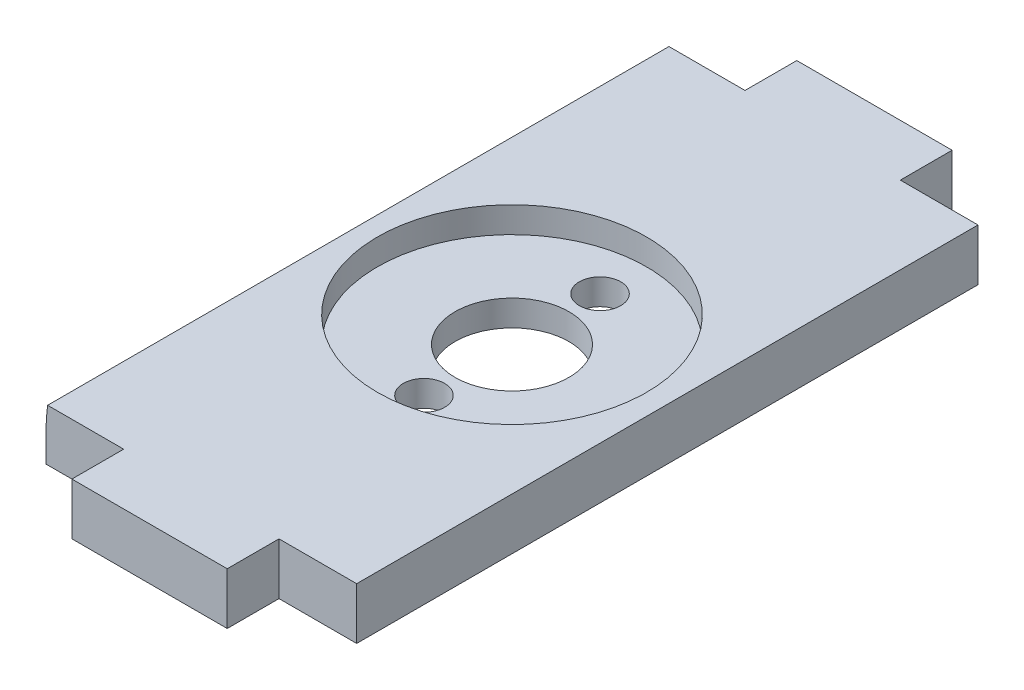
ISO-10303-21;
HEADER;
FILE_DESCRIPTION(('STEP AP214'),'2;1');
FILE_NAME('part.step','',(''),(''),'','','');
FILE_SCHEMA(('AUTOMOTIVE_DESIGN { 1 0 10303 214 1 1 1 1 }'));
ENDSEC;
DATA;
#1=APPLICATION_CONTEXT('core data for automotive mechanical design processes');
#2=APPLICATION_PROTOCOL_DEFINITION('international standard','automotive_design',2000,#1);
#3=PRODUCT_CONTEXT('',#1,'mechanical');
#4=PRODUCT('Part','Part','',(#3));
#5=PRODUCT_RELATED_PRODUCT_CATEGORY('part','',(#4));
#6=PRODUCT_DEFINITION_FORMATION('','',#4);
#7=PRODUCT_DEFINITION_CONTEXT('part definition',#1,'design');
#8=PRODUCT_DEFINITION('design','',#6,#7);
#9=PRODUCT_DEFINITION_SHAPE('','',#8);
#10=(LENGTH_UNIT() NAMED_UNIT(*) SI_UNIT(.MILLI.,.METRE.));
#11=(NAMED_UNIT(*) PLANE_ANGLE_UNIT() SI_UNIT($,.RADIAN.));
#12=(NAMED_UNIT(*) SI_UNIT($,.STERADIAN.) SOLID_ANGLE_UNIT());
#13=UNCERTAINTY_MEASURE_WITH_UNIT(LENGTH_MEASURE(1.E-05),#10,'distance_accuracy_value','');
#14=(GEOMETRIC_REPRESENTATION_CONTEXT(3) GLOBAL_UNCERTAINTY_ASSIGNED_CONTEXT((#13)) GLOBAL_UNIT_ASSIGNED_CONTEXT((#10,
#11,#12)) REPRESENTATION_CONTEXT('',''));
#15=CARTESIAN_POINT('',(0.,0.,0.));
#16=DIRECTION('',(0.,0.,1.));
#17=DIRECTION('',(1.,0.,0.));
#18=AXIS2_PLACEMENT_3D('',#15,#16,#17);
#19=CARTESIAN_POINT('',(0.,5.,0.));
#20=DIRECTION('',(0.,-1.,0.));
#21=DIRECTION('',(0.,0.,-1.));
#22=AXIS2_PLACEMENT_3D('',#19,#20,#21);
#23=CYLINDRICAL_SURFACE('',#22,5.5);
#24=CARTESIAN_POINT('',(0.,0.,0.));
#25=DIRECTION('',(0.,1.,0.));
#26=DIRECTION('',(0.,0.,1.));
#27=AXIS2_PLACEMENT_3D('',#24,#25,#26);
#28=CIRCLE('',#27,5.5);
#29=CARTESIAN_POINT('',(0.,0.,5.5));
#30=VERTEX_POINT('',#29);
#31=EDGE_CURVE('E178',#30,#30,#28,.T.);
#32=ORIENTED_EDGE('',*,*,#31,.F.);
#33=EDGE_LOOP('',(#32));
#34=FACE_BOUND('',#33,.T.);
#35=CARTESIAN_POINT('',(0.,2.5,0.));
#36=DIRECTION('',(0.,1.,0.));
#37=DIRECTION('',(0.,0.,1.));
#38=AXIS2_PLACEMENT_3D('',#35,#36,#37);
#39=CIRCLE('',#38,5.5);
#40=CARTESIAN_POINT('',(0.,2.5,5.5));
#41=VERTEX_POINT('',#40);
#42=EDGE_CURVE('E311',#41,#41,#39,.T.);
#43=ORIENTED_EDGE('',*,*,#42,.T.);
#44=EDGE_LOOP('',(#43));
#45=FACE_BOUND('',#44,.T.);
#46=ADVANCED_FACE('F39',(#34,#45),#23,.F.);
#47=CARTESIAN_POINT('',(0.,5.,-8.5));
#48=DIRECTION('',(0.,-1.,0.));
#49=DIRECTION('',(0.,0.,-1.));
#50=AXIS2_PLACEMENT_3D('',#47,#48,#49);
#51=CYLINDRICAL_SURFACE('',#50,2.);
#52=CARTESIAN_POINT('',(0.,0.,-8.5));
#53=DIRECTION('',(0.,1.,0.));
#54=DIRECTION('',(0.,0.,1.));
#55=AXIS2_PLACEMENT_3D('',#52,#53,#54);
#56=CIRCLE('',#55,2.);
#57=CARTESIAN_POINT('',(0.,0.,-6.5));
#58=VERTEX_POINT('',#57);
#59=EDGE_CURVE('E303',#58,#58,#56,.T.);
#60=ORIENTED_EDGE('',*,*,#59,.F.);
#61=EDGE_LOOP('',(#60));
#62=FACE_BOUND('',#61,.T.);
#63=CARTESIAN_POINT('',(0.,2.5,-8.5));
#64=DIRECTION('',(0.,1.,0.));
#65=DIRECTION('',(0.,0.,1.));
#66=AXIS2_PLACEMENT_3D('',#63,#64,#65);
#67=CIRCLE('',#66,2.);
#68=CARTESIAN_POINT('',(0.,2.5,-6.5));
#69=VERTEX_POINT('',#68);
#70=EDGE_CURVE('E315',#69,#69,#67,.T.);
#71=ORIENTED_EDGE('',*,*,#70,.T.);
#72=EDGE_LOOP('',(#71));
#73=FACE_BOUND('',#72,.T.);
#74=ADVANCED_FACE('F356',(#62,#73),#51,.F.);
#75=CARTESIAN_POINT('',(0.,5.,8.5));
#76=DIRECTION('',(0.,-1.,0.));
#77=DIRECTION('',(0.,0.,-1.));
#78=AXIS2_PLACEMENT_3D('',#75,#76,#77);
#79=CYLINDRICAL_SURFACE('',#78,2.);
#80=CARTESIAN_POINT('',(0.,0.,8.5));
#81=DIRECTION('',(0.,1.,0.));
#82=DIRECTION('',(0.,0.,1.));
#83=AXIS2_PLACEMENT_3D('',#80,#81,#82);
#84=CIRCLE('',#83,2.);
#85=CARTESIAN_POINT('',(0.,0.,10.5));
#86=VERTEX_POINT('',#85);
#87=EDGE_CURVE('E307',#86,#86,#84,.T.);
#88=ORIENTED_EDGE('',*,*,#87,.F.);
#89=EDGE_LOOP('',(#88));
#90=FACE_BOUND('',#89,.T.);
#91=CARTESIAN_POINT('',(0.,2.5,8.5));
#92=DIRECTION('',(0.,1.,0.));
#93=DIRECTION('',(0.,0.,1.));
#94=AXIS2_PLACEMENT_3D('',#91,#92,#93);
#95=CIRCLE('',#94,2.);
#96=CARTESIAN_POINT('',(0.,2.5,10.5));
#97=VERTEX_POINT('',#96);
#98=EDGE_CURVE('E43',#97,#97,#95,.T.);
#99=ORIENTED_EDGE('',*,*,#98,.T.);
#100=EDGE_LOOP('',(#99));
#101=FACE_BOUND('',#100,.T.);
#102=ADVANCED_FACE('F362',(#90,#101),#79,.F.);
#103=CARTESIAN_POINT('',(0.,5.,0.));
#104=DIRECTION('',(0.,1.,0.));
#105=DIRECTION('',(0.,0.,1.));
#106=AXIS2_PLACEMENT_3D('',#103,#104,#105);
#107=PLANE('',#106);
#108=DIRECTION('',(0.,0.,1.));
#109=VECTOR('',#108,1.);
#110=CARTESIAN_POINT('',(-14.8431348329844,5.,-32.5049165017267));
#111=LINE('',#110,#109);
#112=CARTESIAN_POINT('',(-14.8431348329844,5.,-30.));
#113=VERTEX_POINT('',#112);
#114=CARTESIAN_POINT('',(-14.8431348329844,5.,30.));
#115=VERTEX_POINT('',#114);
#116=EDGE_CURVE('E329',#113,#115,#111,.T.);
#117=ORIENTED_EDGE('',*,*,#116,.T.);
#118=DIRECTION('',(1.,0.,0.));
#119=VECTOR('',#118,1.);
#120=CARTESIAN_POINT('',(-15.,5.,30.));
#121=LINE('',#120,#119);
#122=CARTESIAN_POINT('',(-7.5,5.,30.));
#123=VERTEX_POINT('',#122);
#124=EDGE_CURVE('E268',#115,#123,#121,.T.);
#125=ORIENTED_EDGE('',*,*,#124,.T.);
#126=DIRECTION('',(0.,0.,1.));
#127=VECTOR('',#126,1.);
#128=CARTESIAN_POINT('',(-7.5,5.,30.));
#129=LINE('',#128,#127);
#130=CARTESIAN_POINT('',(-7.5,5.,35.));
#131=VERTEX_POINT('',#130);
#132=EDGE_CURVE('E273',#123,#131,#129,.T.);
#133=ORIENTED_EDGE('',*,*,#132,.T.);
#134=DIRECTION('',(1.,0.,0.));
#135=VECTOR('',#134,1.);
#136=CARTESIAN_POINT('',(-7.5,5.,35.));
#137=LINE('',#136,#135);
#138=CARTESIAN_POINT('',(7.5,5.,35.));
#139=VERTEX_POINT('',#138);
#140=EDGE_CURVE('E148',#131,#139,#137,.T.);
#141=ORIENTED_EDGE('',*,*,#140,.T.);
#142=DIRECTION('',(0.,0.,-1.));
#143=VECTOR('',#142,1.);
#144=CARTESIAN_POINT('',(7.5,5.,30.));
#145=LINE('',#144,#143);
#146=CARTESIAN_POINT('',(7.5,5.,30.));
#147=VERTEX_POINT('',#146);
#148=EDGE_CURVE('E139',#139,#147,#145,.T.);
#149=ORIENTED_EDGE('',*,*,#148,.T.);
#150=DIRECTION('',(1.,0.,0.));
#151=VECTOR('',#150,1.);
#152=CARTESIAN_POINT('',(7.5,5.,30.));
#153=LINE('',#152,#151);
#154=CARTESIAN_POINT('',(15.,5.,30.));
#155=VERTEX_POINT('',#154);
#156=EDGE_CURVE('E145',#147,#155,#153,.T.);
#157=ORIENTED_EDGE('',*,*,#156,.T.);
#158=DIRECTION('',(0.,0.,-1.));
#159=VECTOR('',#158,1.);
#160=CARTESIAN_POINT('',(15.,5.,30.));
#161=LINE('',#160,#159);
#162=CARTESIAN_POINT('',(15.,5.,-30.));
#163=VERTEX_POINT('',#162);
#164=EDGE_CURVE('E65',#155,#163,#161,.T.);
#165=ORIENTED_EDGE('',*,*,#164,.T.);
#166=DIRECTION('',(-1.,0.,0.));
#167=VECTOR('',#166,1.);
#168=CARTESIAN_POINT('',(7.5,5.,-30.));
#169=LINE('',#168,#167);
#170=CARTESIAN_POINT('',(7.5,5.,-30.));
#171=VERTEX_POINT('',#170);
#172=EDGE_CURVE('E211',#163,#171,#169,.T.);
#173=ORIENTED_EDGE('',*,*,#172,.T.);
#174=DIRECTION('',(0.,0.,-1.));
#175=VECTOR('',#174,1.);
#176=CARTESIAN_POINT('',(7.5,5.,-30.));
#177=LINE('',#176,#175);
#178=CARTESIAN_POINT('',(7.5,5.,-35.));
#179=VERTEX_POINT('',#178);
#180=EDGE_CURVE('E118',#171,#179,#177,.T.);
#181=ORIENTED_EDGE('',*,*,#180,.T.);
#182=DIRECTION('',(-1.,0.,0.));
#183=VECTOR('',#182,1.);
#184=CARTESIAN_POINT('',(-7.5,5.,-35.));
#185=LINE('',#184,#183);
#186=CARTESIAN_POINT('',(-7.5,5.,-35.));
#187=VERTEX_POINT('',#186);
#188=EDGE_CURVE('E247',#179,#187,#185,.T.);
#189=ORIENTED_EDGE('',*,*,#188,.T.);
#190=DIRECTION('',(0.,0.,1.));
#191=VECTOR('',#190,1.);
#192=CARTESIAN_POINT('',(-7.5,5.,-30.));
#193=LINE('',#192,#191);
#194=CARTESIAN_POINT('',(-7.5,5.,-30.));
#195=VERTEX_POINT('',#194);
#196=EDGE_CURVE('E269',#187,#195,#193,.T.);
#197=ORIENTED_EDGE('',*,*,#196,.T.);
#198=DIRECTION('',(-1.,0.,0.));
#199=VECTOR('',#198,1.);
#200=CARTESIAN_POINT('',(-15.,5.,-30.));
#201=LINE('',#200,#199);
#202=EDGE_CURVE('E265',#195,#113,#201,.T.);
#203=ORIENTED_EDGE('',*,*,#202,.T.);
#204=EDGE_LOOP('',(#117,#125,#133,#141,#149,#157,#165,#173,#181,#189,#197,#203));
#205=FACE_BOUND('',#204,.T.);
#206=CARTESIAN_POINT('',(0.,5.,0.));
#207=DIRECTION('',(0.,1.,0.));
#208=DIRECTION('',(0.,0.,1.));
#209=AXIS2_PLACEMENT_3D('',#206,#207,#208);
#210=CIRCLE('',#209,13.);
#211=CARTESIAN_POINT('',(0.,5.,13.));
#212=VERTEX_POINT('',#211);
#213=EDGE_CURVE('E319',#212,#212,#210,.T.);
#214=ORIENTED_EDGE('',*,*,#213,.F.);
#215=EDGE_LOOP('',(#214));
#216=FACE_BOUND('',#215,.T.);
#217=ADVANCED_FACE('F142',(#205,#216),#107,.T.);
#218=CARTESIAN_POINT('',(0.,0.,0.));
#219=DIRECTION('',(0.,1.,0.));
#220=DIRECTION('',(0.,0.,1.));
#221=AXIS2_PLACEMENT_3D('',#218,#219,#220);
#222=PLANE('',#221);
#223=DIRECTION('',(-1.,0.,0.));
#224=VECTOR('',#223,1.);
#225=CARTESIAN_POINT('',(7.5,0.,-30.));
#226=LINE('',#225,#224);
#227=CARTESIAN_POINT('',(15.,0.,-30.));
#228=VERTEX_POINT('',#227);
#229=CARTESIAN_POINT('',(7.5,0.,-30.));
#230=VERTEX_POINT('',#229);
#231=EDGE_CURVE('E173',#228,#230,#226,.T.);
#232=ORIENTED_EDGE('',*,*,#231,.F.);
#233=DIRECTION('',(0.,0.,-1.));
#234=VECTOR('',#233,1.);
#235=CARTESIAN_POINT('',(15.,0.,30.));
#236=LINE('',#235,#234);
#237=CARTESIAN_POINT('',(15.,0.,30.));
#238=VERTEX_POINT('',#237);
#239=EDGE_CURVE('E110',#238,#228,#236,.T.);
#240=ORIENTED_EDGE('',*,*,#239,.F.);
#241=DIRECTION('',(1.,0.,0.));
#242=VECTOR('',#241,1.);
#243=CARTESIAN_POINT('',(7.5,0.,30.));
#244=LINE('',#243,#242);
#245=CARTESIAN_POINT('',(7.5,0.,30.));
#246=VERTEX_POINT('',#245);
#247=EDGE_CURVE('E206',#246,#238,#244,.T.);
#248=ORIENTED_EDGE('',*,*,#247,.F.);
#249=DIRECTION('',(0.,0.,-1.));
#250=VECTOR('',#249,1.);
#251=CARTESIAN_POINT('',(7.5,0.,30.));
#252=LINE('',#251,#250);
#253=CARTESIAN_POINT('',(7.5,0.,35.));
#254=VERTEX_POINT('',#253);
#255=EDGE_CURVE('E158',#254,#246,#252,.T.);
#256=ORIENTED_EDGE('',*,*,#255,.F.);
#257=DIRECTION('',(1.,0.,0.));
#258=VECTOR('',#257,1.);
#259=CARTESIAN_POINT('',(-7.5,0.,35.));
#260=LINE('',#259,#258);
#261=CARTESIAN_POINT('',(-7.5,0.,35.));
#262=VERTEX_POINT('',#261);
#263=EDGE_CURVE('E201',#262,#254,#260,.T.);
#264=ORIENTED_EDGE('',*,*,#263,.F.);
#265=DIRECTION('',(0.,0.,1.));
#266=VECTOR('',#265,1.);
#267=CARTESIAN_POINT('',(-7.5,0.,30.));
#268=LINE('',#267,#266);
#269=CARTESIAN_POINT('',(-7.5,0.,30.));
#270=VERTEX_POINT('',#269);
#271=EDGE_CURVE('E198',#270,#262,#268,.T.);
#272=ORIENTED_EDGE('',*,*,#271,.F.);
#273=DIRECTION('',(1.,0.,0.));
#274=VECTOR('',#273,1.);
#275=CARTESIAN_POINT('',(-15.,0.,30.));
#276=LINE('',#275,#274);
#277=CARTESIAN_POINT('',(-15.,0.,30.));
#278=VERTEX_POINT('',#277);
#279=EDGE_CURVE('E195',#278,#270,#276,.T.);
#280=ORIENTED_EDGE('',*,*,#279,.F.);
#281=DIRECTION('',(0.,0.,1.));
#282=VECTOR('',#281,1.);
#283=CARTESIAN_POINT('',(-15.,0.,30.));
#284=LINE('',#283,#282);
#285=CARTESIAN_POINT('',(-15.,0.,-30.));
#286=VERTEX_POINT('',#285);
#287=EDGE_CURVE('E191',#286,#278,#284,.T.);
#288=ORIENTED_EDGE('',*,*,#287,.F.);
#289=DIRECTION('',(-1.,0.,0.));
#290=VECTOR('',#289,1.);
#291=CARTESIAN_POINT('',(-15.,0.,-30.));
#292=LINE('',#291,#290);
#293=CARTESIAN_POINT('',(-7.5,0.,-30.));
#294=VERTEX_POINT('',#293);
#295=EDGE_CURVE('E187',#294,#286,#292,.T.);
#296=ORIENTED_EDGE('',*,*,#295,.F.);
#297=DIRECTION('',(0.,0.,1.));
#298=VECTOR('',#297,1.);
#299=CARTESIAN_POINT('',(-7.5,0.,-30.));
#300=LINE('',#299,#298);
#301=CARTESIAN_POINT('',(-7.5,0.,-35.));
#302=VERTEX_POINT('',#301);
#303=EDGE_CURVE('E184',#302,#294,#300,.T.);
#304=ORIENTED_EDGE('',*,*,#303,.F.);
#305=DIRECTION('',(-1.,0.,0.));
#306=VECTOR('',#305,1.);
#307=CARTESIAN_POINT('',(-7.5,0.,-35.));
#308=LINE('',#307,#306);
#309=CARTESIAN_POINT('',(7.5,0.,-35.));
#310=VERTEX_POINT('',#309);
#311=EDGE_CURVE('E181',#310,#302,#308,.T.);
#312=ORIENTED_EDGE('',*,*,#311,.F.);
#313=DIRECTION('',(0.,0.,-1.));
#314=VECTOR('',#313,1.);
#315=CARTESIAN_POINT('',(7.5,0.,-30.));
#316=LINE('',#315,#314);
#317=EDGE_CURVE('E177',#230,#310,#316,.T.);
#318=ORIENTED_EDGE('',*,*,#317,.F.);
#319=EDGE_LOOP('',(#232,#240,#248,#256,#264,#272,#280,#288,#296,#304,#312,#318));
#320=FACE_BOUND('',#319,.T.);
#321=ORIENTED_EDGE('',*,*,#31,.T.);
#322=EDGE_LOOP('',(#321));
#323=FACE_BOUND('',#322,.T.);
#324=ORIENTED_EDGE('',*,*,#59,.T.);
#325=EDGE_LOOP('',(#324));
#326=FACE_BOUND('',#325,.T.);
#327=ORIENTED_EDGE('',*,*,#87,.T.);
#328=EDGE_LOOP('',(#327));
#329=FACE_BOUND('',#328,.T.);
#330=ADVANCED_FACE('F251',(#320,#323,#326,#329),#222,.F.);
#331=CARTESIAN_POINT('',(7.5,5.,-30.));
#332=DIRECTION('',(0.,0.,1.));
#333=DIRECTION('',(1.,0.,0.));
#334=AXIS2_PLACEMENT_3D('',#331,#332,#333);
#335=PLANE('',#334);
#336=ORIENTED_EDGE('',*,*,#231,.T.);
#337=DIRECTION('',(0.,-1.,0.));
#338=VECTOR('',#337,1.);
#339=CARTESIAN_POINT('',(7.5,5.,-30.));
#340=LINE('',#339,#338);
#341=EDGE_CURVE('E11',#171,#230,#340,.T.);
#342=ORIENTED_EDGE('',*,*,#341,.F.);
#343=ORIENTED_EDGE('',*,*,#172,.F.);
#344=DIRECTION('',(0.,-1.,0.));
#345=VECTOR('',#344,1.);
#346=CARTESIAN_POINT('',(15.,5.,-30.));
#347=LINE('',#346,#345);
#348=EDGE_CURVE('E169',#163,#228,#347,.T.);
#349=ORIENTED_EDGE('',*,*,#348,.T.);
#350=EDGE_LOOP('',(#336,#342,#343,#349));
#351=FACE_BOUND('',#350,.T.);
#352=ADVANCED_FACE('F41',(#351),#335,.F.);
#353=CARTESIAN_POINT('',(7.5,5.,-30.));
#354=DIRECTION('',(-1.,0.,0.));
#355=DIRECTION('',(0.,0.,1.));
#356=AXIS2_PLACEMENT_3D('',#353,#354,#355);
#357=PLANE('',#356);
#358=ORIENTED_EDGE('',*,*,#317,.T.);
#359=DIRECTION('',(0.,-1.,0.));
#360=VECTOR('',#359,1.);
#361=CARTESIAN_POINT('',(7.5,5.,-35.));
#362=LINE('',#361,#360);
#363=EDGE_CURVE('E49',#179,#310,#362,.T.);
#364=ORIENTED_EDGE('',*,*,#363,.F.);
#365=ORIENTED_EDGE('',*,*,#180,.F.);
#366=ORIENTED_EDGE('',*,*,#341,.T.);
#367=EDGE_LOOP('',(#358,#364,#365,#366));
#368=FACE_BOUND('',#367,.T.);
#369=ADVANCED_FACE('F460',(#368),#357,.F.);
#370=CARTESIAN_POINT('',(-7.5,5.,-35.));
#371=DIRECTION('',(0.,0.,1.));
#372=DIRECTION('',(1.,0.,0.));
#373=AXIS2_PLACEMENT_3D('',#370,#371,#372);
#374=PLANE('',#373);
#375=ORIENTED_EDGE('',*,*,#311,.T.);
#376=DIRECTION('',(0.,-1.,0.));
#377=VECTOR('',#376,1.);
#378=CARTESIAN_POINT('',(-7.5,5.,-35.));
#379=LINE('',#378,#377);
#380=EDGE_CURVE('E236',#187,#302,#379,.T.);
#381=ORIENTED_EDGE('',*,*,#380,.F.);
#382=ORIENTED_EDGE('',*,*,#188,.F.);
#383=ORIENTED_EDGE('',*,*,#363,.T.);
#384=EDGE_LOOP('',(#375,#381,#382,#383));
#385=FACE_BOUND('',#384,.T.);
#386=ADVANCED_FACE('F245',(#385),#374,.F.);
#387=CARTESIAN_POINT('',(-7.5,5.,-30.));
#388=DIRECTION('',(1.,0.,0.));
#389=DIRECTION('',(0.,0.,-1.));
#390=AXIS2_PLACEMENT_3D('',#387,#388,#389);
#391=PLANE('',#390);
#392=ORIENTED_EDGE('',*,*,#303,.T.);
#393=DIRECTION('',(0.,-1.,0.));
#394=VECTOR('',#393,1.);
#395=CARTESIAN_POINT('',(-7.5,5.,-30.));
#396=LINE('',#395,#394);
#397=EDGE_CURVE('E232',#195,#294,#396,.T.);
#398=ORIENTED_EDGE('',*,*,#397,.F.);
#399=ORIENTED_EDGE('',*,*,#196,.F.);
#400=ORIENTED_EDGE('',*,*,#380,.T.);
#401=EDGE_LOOP('',(#392,#398,#399,#400));
#402=FACE_BOUND('',#401,.T.);
#403=ADVANCED_FACE('F257',(#402),#391,.F.);
#404=CARTESIAN_POINT('',(-15.,5.,-30.));
#405=DIRECTION('',(0.,0.,1.));
#406=DIRECTION('',(1.,0.,0.));
#407=AXIS2_PLACEMENT_3D('',#404,#405,#406);
#408=PLANE('',#407);
#409=DIRECTION('',(0.,-1.,0.));
#410=VECTOR('',#409,1.);
#411=CARTESIAN_POINT('',(-15.,5.,-30.));
#412=LINE('',#411,#410);
#413=CARTESIAN_POINT('',(-15.,2.5,-30.));
#414=VERTEX_POINT('',#413);
#415=EDGE_CURVE('E229',#414,#286,#412,.T.);
#416=ORIENTED_EDGE('',*,*,#415,.F.);
#417=CARTESIAN_POINT('',(5.,2.5,-30.));
#418=DIRECTION('',(0.,0.,1.));
#419=DIRECTION('',(1.,0.,0.));
#420=AXIS2_PLACEMENT_3D('',#417,#418,#419);
#421=CIRCLE('',#420,20.);
#422=EDGE_CURVE('E266',#113,#414,#421,.T.);
#423=ORIENTED_EDGE('',*,*,#422,.F.);
#424=ORIENTED_EDGE('',*,*,#202,.F.);
#425=ORIENTED_EDGE('',*,*,#397,.T.);
#426=ORIENTED_EDGE('',*,*,#295,.T.);
#427=EDGE_LOOP('',(#416,#423,#424,#425,#426));
#428=FACE_BOUND('',#427,.T.);
#429=ADVANCED_FACE('F262',(#428),#408,.F.);
#430=CARTESIAN_POINT('',(-15.,5.,30.));
#431=DIRECTION('',(1.,0.,0.));
#432=DIRECTION('',(0.,0.,-1.));
#433=AXIS2_PLACEMENT_3D('',#430,#431,#432);
#434=PLANE('',#433);
#435=DIRECTION('',(0.,-1.,0.));
#436=VECTOR('',#435,1.);
#437=CARTESIAN_POINT('',(-15.,5.,30.));
#438=LINE('',#437,#436);
#439=CARTESIAN_POINT('',(-15.,2.5,30.));
#440=VERTEX_POINT('',#439);
#441=EDGE_CURVE('E226',#440,#278,#438,.T.);
#442=ORIENTED_EDGE('',*,*,#441,.F.);
#443=DIRECTION('',(0.,0.,1.));
#444=VECTOR('',#443,1.);
#445=CARTESIAN_POINT('',(-15.,2.5,-32.5049165017267));
#446=LINE('',#445,#444);
#447=EDGE_CURVE('E56',#414,#440,#446,.T.);
#448=ORIENTED_EDGE('',*,*,#447,.F.);
#449=ORIENTED_EDGE('',*,*,#415,.T.);
#450=ORIENTED_EDGE('',*,*,#287,.T.);
#451=EDGE_LOOP('',(#442,#448,#449,#450));
#452=FACE_BOUND('',#451,.T.);
#453=ADVANCED_FACE('F342',(#452),#434,.F.);
#454=CARTESIAN_POINT('',(-15.,5.,30.));
#455=DIRECTION('',(0.,0.,-1.));
#456=DIRECTION('',(-1.,0.,0.));
#457=AXIS2_PLACEMENT_3D('',#454,#455,#456);
#458=PLANE('',#457);
#459=ORIENTED_EDGE('',*,*,#124,.F.);
#460=CARTESIAN_POINT('',(5.,2.5,30.));
#461=DIRECTION('',(0.,0.,-1.));
#462=DIRECTION('',(1.,0.,0.));
#463=AXIS2_PLACEMENT_3D('',#460,#461,#462);
#464=CIRCLE('',#463,20.);
#465=EDGE_CURVE('E330',#440,#115,#464,.T.);
#466=ORIENTED_EDGE('',*,*,#465,.F.);
#467=ORIENTED_EDGE('',*,*,#441,.T.);
#468=ORIENTED_EDGE('',*,*,#279,.T.);
#469=DIRECTION('',(0.,-1.,0.));
#470=VECTOR('',#469,1.);
#471=CARTESIAN_POINT('',(-7.5,5.,30.));
#472=LINE('',#471,#470);
#473=EDGE_CURVE('E222',#123,#270,#472,.T.);
#474=ORIENTED_EDGE('',*,*,#473,.F.);
#475=EDGE_LOOP('',(#459,#466,#467,#468,#474));
#476=FACE_BOUND('',#475,.T.);
#477=ADVANCED_FACE('F345',(#476),#458,.F.);
#478=CARTESIAN_POINT('',(-7.5,5.,30.));
#479=DIRECTION('',(1.,0.,0.));
#480=DIRECTION('',(0.,0.,-1.));
#481=AXIS2_PLACEMENT_3D('',#478,#479,#480);
#482=PLANE('',#481);
#483=ORIENTED_EDGE('',*,*,#271,.T.);
#484=DIRECTION('',(0.,-1.,0.));
#485=VECTOR('',#484,1.);
#486=CARTESIAN_POINT('',(-7.5,5.,35.));
#487=LINE('',#486,#485);
#488=EDGE_CURVE('E218',#131,#262,#487,.T.);
#489=ORIENTED_EDGE('',*,*,#488,.F.);
#490=ORIENTED_EDGE('',*,*,#132,.F.);
#491=ORIENTED_EDGE('',*,*,#473,.T.);
#492=EDGE_LOOP('',(#483,#489,#490,#491));
#493=FACE_BOUND('',#492,.T.);
#494=ADVANCED_FACE('F285',(#493),#482,.F.);
#495=CARTESIAN_POINT('',(-7.5,5.,35.));
#496=DIRECTION('',(0.,0.,-1.));
#497=DIRECTION('',(-1.,0.,0.));
#498=AXIS2_PLACEMENT_3D('',#495,#496,#497);
#499=PLANE('',#498);
#500=ORIENTED_EDGE('',*,*,#263,.T.);
#501=DIRECTION('',(0.,-1.,0.));
#502=VECTOR('',#501,1.);
#503=CARTESIAN_POINT('',(7.5,5.,35.));
#504=LINE('',#503,#502);
#505=EDGE_CURVE('E162',#139,#254,#504,.T.);
#506=ORIENTED_EDGE('',*,*,#505,.F.);
#507=ORIENTED_EDGE('',*,*,#140,.F.);
#508=ORIENTED_EDGE('',*,*,#488,.T.);
#509=EDGE_LOOP('',(#500,#506,#507,#508));
#510=FACE_BOUND('',#509,.T.);
#511=ADVANCED_FACE('F289',(#510),#499,.F.);
#512=CARTESIAN_POINT('',(7.5,5.,30.));
#513=DIRECTION('',(-1.,0.,0.));
#514=DIRECTION('',(0.,0.,1.));
#515=AXIS2_PLACEMENT_3D('',#512,#513,#514);
#516=PLANE('',#515);
#517=ORIENTED_EDGE('',*,*,#255,.T.);
#518=DIRECTION('',(0.,-1.,0.));
#519=VECTOR('',#518,1.);
#520=CARTESIAN_POINT('',(7.5,5.,30.));
#521=LINE('',#520,#519);
#522=EDGE_CURVE('E155',#147,#246,#521,.T.);
#523=ORIENTED_EDGE('',*,*,#522,.F.);
#524=ORIENTED_EDGE('',*,*,#148,.F.);
#525=ORIENTED_EDGE('',*,*,#505,.T.);
#526=EDGE_LOOP('',(#517,#523,#524,#525));
#527=FACE_BOUND('',#526,.T.);
#528=ADVANCED_FACE('F156',(#527),#516,.F.);
#529=CARTESIAN_POINT('',(7.5,5.,30.));
#530=DIRECTION('',(0.,0.,-1.));
#531=DIRECTION('',(-1.,0.,0.));
#532=AXIS2_PLACEMENT_3D('',#529,#530,#531);
#533=PLANE('',#532);
#534=ORIENTED_EDGE('',*,*,#247,.T.);
#535=DIRECTION('',(0.,-1.,0.));
#536=VECTOR('',#535,1.);
#537=CARTESIAN_POINT('',(15.,5.,30.));
#538=LINE('',#537,#536);
#539=EDGE_CURVE('E163',#155,#238,#538,.T.);
#540=ORIENTED_EDGE('',*,*,#539,.F.);
#541=ORIENTED_EDGE('',*,*,#156,.F.);
#542=ORIENTED_EDGE('',*,*,#522,.T.);
#543=EDGE_LOOP('',(#534,#540,#541,#542));
#544=FACE_BOUND('',#543,.T.);
#545=ADVANCED_FACE('F165',(#544),#533,.F.);
#546=CARTESIAN_POINT('',(15.,5.,30.));
#547=DIRECTION('',(-1.,0.,0.));
#548=DIRECTION('',(0.,0.,1.));
#549=AXIS2_PLACEMENT_3D('',#546,#547,#548);
#550=PLANE('',#549);
#551=ORIENTED_EDGE('',*,*,#239,.T.);
#552=ORIENTED_EDGE('',*,*,#348,.F.);
#553=ORIENTED_EDGE('',*,*,#164,.F.);
#554=ORIENTED_EDGE('',*,*,#539,.T.);
#555=EDGE_LOOP('',(#551,#552,#553,#554));
#556=FACE_BOUND('',#555,.T.);
#557=ADVANCED_FACE('F290',(#556),#550,.F.);
#558=CARTESIAN_POINT('',(0.,2.5,0.));
#559=DIRECTION('',(0.,1.,0.));
#560=DIRECTION('',(0.,0.,1.));
#561=AXIS2_PLACEMENT_3D('',#558,#559,#560);
#562=CYLINDRICAL_SURFACE('',#561,13.);
#563=CARTESIAN_POINT('',(0.,2.5,0.));
#564=DIRECTION('',(0.,1.,0.));
#565=DIRECTION('',(0.,0.,1.));
#566=AXIS2_PLACEMENT_3D('',#563,#564,#565);
#567=CIRCLE('',#566,13.);
#568=CARTESIAN_POINT('',(0.,2.5,13.));
#569=VERTEX_POINT('',#568);
#570=EDGE_CURVE('E323',#569,#569,#567,.T.);
#571=ORIENTED_EDGE('',*,*,#570,.F.);
#572=EDGE_LOOP('',(#571));
#573=FACE_BOUND('',#572,.T.);
#574=ORIENTED_EDGE('',*,*,#213,.T.);
#575=EDGE_LOOP('',(#574));
#576=FACE_BOUND('',#575,.T.);
#577=ADVANCED_FACE('F375',(#573,#576),#562,.F.);
#578=CARTESIAN_POINT('',(0.,2.5,0.));
#579=DIRECTION('',(0.,1.,0.));
#580=DIRECTION('',(0.,0.,1.));
#581=AXIS2_PLACEMENT_3D('',#578,#579,#580);
#582=PLANE('',#581);
#583=ORIENTED_EDGE('',*,*,#42,.F.);
#584=EDGE_LOOP('',(#583));
#585=FACE_BOUND('',#584,.T.);
#586=ORIENTED_EDGE('',*,*,#70,.F.);
#587=EDGE_LOOP('',(#586));
#588=FACE_BOUND('',#587,.T.);
#589=ORIENTED_EDGE('',*,*,#98,.F.);
#590=EDGE_LOOP('',(#589));
#591=FACE_BOUND('',#590,.T.);
#592=ORIENTED_EDGE('',*,*,#570,.T.);
#593=EDGE_LOOP('',(#592));
#594=FACE_BOUND('',#593,.T.);
#595=ADVANCED_FACE('F403',(#585,#588,#591,#594),#582,.T.);
#596=CARTESIAN_POINT('',(5.,2.5,-32.5049165017267));
#597=DIRECTION('',(0.,0.,1.));
#598=DIRECTION('',(1.,0.,0.));
#599=AXIS2_PLACEMENT_3D('',#596,#597,#598);
#600=CYLINDRICAL_SURFACE('',#599,20.);
#601=ORIENTED_EDGE('',*,*,#422,.T.);
#602=ORIENTED_EDGE('',*,*,#447,.T.);
#603=ORIENTED_EDGE('',*,*,#465,.T.);
#604=ORIENTED_EDGE('',*,*,#116,.F.);
#605=EDGE_LOOP('',(#601,#602,#603,#604));
#606=FACE_BOUND('',#605,.T.);
#607=ADVANCED_FACE('F338',(#606),#600,.T.);
#608=CLOSED_SHELL('',(#46,#74,#102,#217,#330,#352,#369,#386,#403,#429,#453,#477,#494,#511,#528,
#545,#557,#577,#595,#607));
#609=MANIFOLD_SOLID_BREP('B2',#608);
#610=ADVANCED_BREP_SHAPE_REPRESENTATION('',(#18,#609),#14);
#611=SHAPE_DEFINITION_REPRESENTATION(#9,#610);
ENDSEC;
END-ISO-10303-21;
